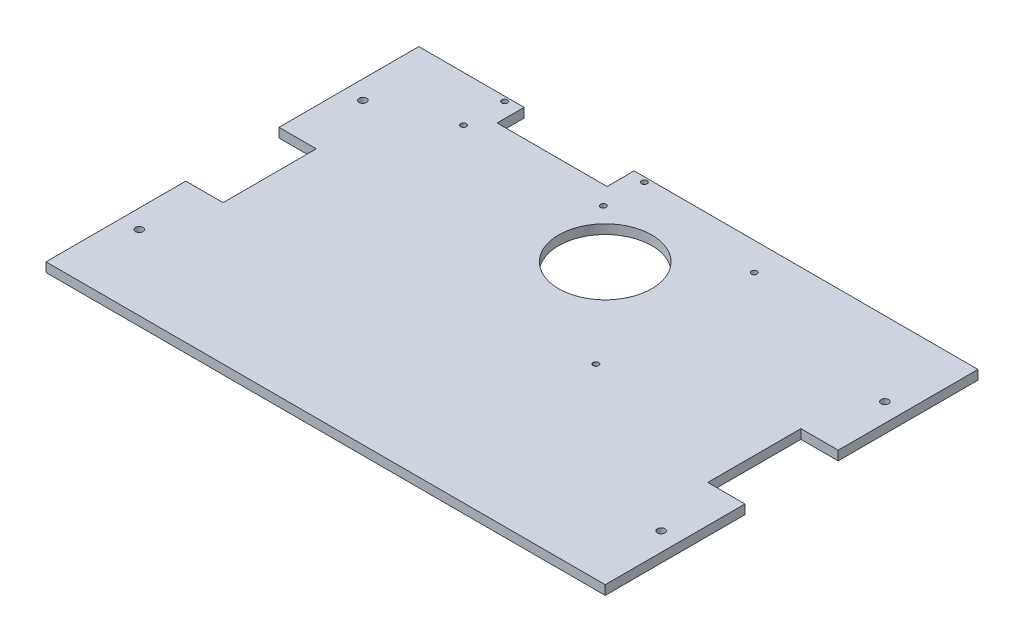
ISO-10303-21;
HEADER;
FILE_DESCRIPTION(('STEP AP214'),'2;1');
FILE_NAME('part.step','',(''),(''),'','','');
FILE_SCHEMA(('AUTOMOTIVE_DESIGN { 1 0 10303 214 1 1 1 1 }'));
ENDSEC;
DATA;
#1=APPLICATION_CONTEXT('core data for automotive mechanical design processes');
#2=APPLICATION_PROTOCOL_DEFINITION('international standard','automotive_design',2000,#1);
#3=PRODUCT_CONTEXT('',#1,'mechanical');
#4=PRODUCT('Part','Part','',(#3));
#5=PRODUCT_RELATED_PRODUCT_CATEGORY('part','',(#4));
#6=PRODUCT_DEFINITION_FORMATION('','',#4);
#7=PRODUCT_DEFINITION_CONTEXT('part definition',#1,'design');
#8=PRODUCT_DEFINITION('design','',#6,#7);
#9=PRODUCT_DEFINITION_SHAPE('','',#8);
#10=(LENGTH_UNIT() NAMED_UNIT(*) SI_UNIT(.MILLI.,.METRE.));
#11=(NAMED_UNIT(*) PLANE_ANGLE_UNIT() SI_UNIT($,.RADIAN.));
#12=(NAMED_UNIT(*) SI_UNIT($,.STERADIAN.) SOLID_ANGLE_UNIT());
#13=UNCERTAINTY_MEASURE_WITH_UNIT(LENGTH_MEASURE(1.E-05),#10,'distance_accuracy_value','');
#14=(GEOMETRIC_REPRESENTATION_CONTEXT(3) GLOBAL_UNCERTAINTY_ASSIGNED_CONTEXT((#13)) GLOBAL_UNIT_ASSIGNED_CONTEXT((#10,
#11,#12)) REPRESENTATION_CONTEXT('',''));
#15=CARTESIAN_POINT('',(0.,0.,0.));
#16=DIRECTION('',(0.,0.,1.));
#17=DIRECTION('',(1.,0.,0.));
#18=AXIS2_PLACEMENT_3D('',#15,#16,#17);
#19=CARTESIAN_POINT('',(150.,5.,-100.));
#20=DIRECTION('',(-1.,0.,0.));
#21=DIRECTION('',(0.,0.,1.));
#22=AXIS2_PLACEMENT_3D('',#19,#20,#21);
#23=PLANE('',#22);
#24=DIRECTION('',(0.,0.,-1.));
#25=VECTOR('',#24,1.);
#26=CARTESIAN_POINT('',(150.,5.,-100.));
#27=LINE('',#26,#25);
#28=CARTESIAN_POINT('',(150.,5.,-25.));
#29=VERTEX_POINT('',#28);
#30=CARTESIAN_POINT('',(150.,5.,-100.));
#31=VERTEX_POINT('',#30);
#32=EDGE_CURVE('E181',#29,#31,#27,.T.);
#33=ORIENTED_EDGE('',*,*,#32,.F.);
#34=DIRECTION('',(0.,1.,0.));
#35=VECTOR('',#34,1.);
#36=CARTESIAN_POINT('',(150.,0.,-25.));
#37=LINE('',#36,#35);
#38=CARTESIAN_POINT('',(150.,0.,-25.));
#39=VERTEX_POINT('',#38);
#40=EDGE_CURVE('E237',#39,#29,#37,.T.);
#41=ORIENTED_EDGE('',*,*,#40,.F.);
#42=DIRECTION('',(0.,0.,-1.));
#43=VECTOR('',#42,1.);
#44=CARTESIAN_POINT('',(150.,0.,-100.));
#45=LINE('',#44,#43);
#46=CARTESIAN_POINT('',(150.,0.,-100.));
#47=VERTEX_POINT('',#46);
#48=EDGE_CURVE('E312',#39,#47,#45,.T.);
#49=ORIENTED_EDGE('',*,*,#48,.T.);
#50=DIRECTION('',(0.,-1.,0.));
#51=VECTOR('',#50,1.);
#52=CARTESIAN_POINT('',(150.,5.,-100.));
#53=LINE('',#52,#51);
#54=EDGE_CURVE('E11',#31,#47,#53,.T.);
#55=ORIENTED_EDGE('',*,*,#54,.F.);
#56=EDGE_LOOP('',(#33,#41,#49,#55));
#57=FACE_BOUND('',#56,.T.);
#58=ADVANCED_FACE('F34',(#57),#23,.F.);
#59=CARTESIAN_POINT('',(-150.,5.,-100.));
#60=DIRECTION('',(1.,0.,0.));
#61=DIRECTION('',(0.,0.,-1.));
#62=AXIS2_PLACEMENT_3D('',#59,#60,#61);
#63=PLANE('',#62);
#64=DIRECTION('',(0.,0.,1.));
#65=VECTOR('',#64,1.);
#66=CARTESIAN_POINT('',(-150.,0.,-100.));
#67=LINE('',#66,#65);
#68=CARTESIAN_POINT('',(-150.,0.,-100.));
#69=VERTEX_POINT('',#68);
#70=CARTESIAN_POINT('',(-150.,0.,-25.));
#71=VERTEX_POINT('',#70);
#72=EDGE_CURVE('E171',#69,#71,#67,.T.);
#73=ORIENTED_EDGE('',*,*,#72,.T.);
#74=DIRECTION('',(0.,1.,0.));
#75=VECTOR('',#74,1.);
#76=CARTESIAN_POINT('',(-150.,0.,-25.));
#77=LINE('',#76,#75);
#78=CARTESIAN_POINT('',(-150.,5.,-25.));
#79=VERTEX_POINT('',#78);
#80=EDGE_CURVE('E213',#71,#79,#77,.T.);
#81=ORIENTED_EDGE('',*,*,#80,.T.);
#82=DIRECTION('',(0.,0.,1.));
#83=VECTOR('',#82,1.);
#84=CARTESIAN_POINT('',(-150.,5.,-100.));
#85=LINE('',#84,#83);
#86=CARTESIAN_POINT('',(-150.,5.,-100.));
#87=VERTEX_POINT('',#86);
#88=EDGE_CURVE('E195',#87,#79,#85,.T.);
#89=ORIENTED_EDGE('',*,*,#88,.F.);
#90=DIRECTION('',(0.,-1.,0.));
#91=VECTOR('',#90,1.);
#92=CARTESIAN_POINT('',(-150.,5.,-100.));
#93=LINE('',#92,#91);
#94=EDGE_CURVE('E42',#87,#69,#93,.T.);
#95=ORIENTED_EDGE('',*,*,#94,.T.);
#96=EDGE_LOOP('',(#73,#81,#89,#95));
#97=FACE_BOUND('',#96,.T.);
#98=ADVANCED_FACE('F192',(#97),#63,.F.);
#99=CARTESIAN_POINT('',(-150.,5.,-100.));
#100=DIRECTION('',(0.,0.,1.));
#101=DIRECTION('',(1.,0.,0.));
#102=AXIS2_PLACEMENT_3D('',#99,#100,#101);
#103=PLANE('',#102);
#104=DIRECTION('',(-1.,0.,0.));
#105=VECTOR('',#104,1.);
#106=CARTESIAN_POINT('',(-150.,5.,-100.));
#107=LINE('',#106,#105);
#108=CARTESIAN_POINT('',(-93.5,5.,-100.));
#109=VERTEX_POINT('',#108);
#110=EDGE_CURVE('E336',#109,#87,#107,.T.);
#111=ORIENTED_EDGE('',*,*,#110,.F.);
#112=DIRECTION('',(0.,-1.,0.));
#113=VECTOR('',#112,1.);
#114=CARTESIAN_POINT('',(-93.5,5.,-100.));
#115=LINE('',#114,#113);
#116=CARTESIAN_POINT('',(-93.5,0.,-100.));
#117=VERTEX_POINT('',#116);
#118=EDGE_CURVE('E263',#109,#117,#115,.T.);
#119=ORIENTED_EDGE('',*,*,#118,.T.);
#120=DIRECTION('',(-1.,0.,0.));
#121=VECTOR('',#120,1.);
#122=CARTESIAN_POINT('',(-150.,0.,-100.));
#123=LINE('',#122,#121);
#124=EDGE_CURVE('E176',#117,#69,#123,.T.);
#125=ORIENTED_EDGE('',*,*,#124,.T.);
#126=ORIENTED_EDGE('',*,*,#94,.F.);
#127=EDGE_LOOP('',(#111,#119,#125,#126));
#128=FACE_BOUND('',#127,.T.);
#129=ADVANCED_FACE('F384',(#128),#103,.F.);
#130=CARTESIAN_POINT('',(150.,0.,100.));
#131=VERTEX_POINT('',#130);
#132=CARTESIAN_POINT('',(150.,0.,25.));
#133=VERTEX_POINT('',#132);
#134=EDGE_CURVE('E341',#131,#133,#45,.T.);
#135=ORIENTED_EDGE('',*,*,#134,.T.);
#136=DIRECTION('',(0.,1.,0.));
#137=VECTOR('',#136,1.);
#138=CARTESIAN_POINT('',(150.,0.,25.));
#139=LINE('',#138,#137);
#140=CARTESIAN_POINT('',(150.,5.,25.));
#141=VERTEX_POINT('',#140);
#142=EDGE_CURVE('E57',#133,#141,#139,.T.);
#143=ORIENTED_EDGE('',*,*,#142,.T.);
#144=CARTESIAN_POINT('',(150.,5.,100.));
#145=VERTEX_POINT('',#144);
#146=EDGE_CURVE('E333',#145,#141,#27,.T.);
#147=ORIENTED_EDGE('',*,*,#146,.F.);
#148=DIRECTION('',(0.,-1.,0.));
#149=VECTOR('',#148,1.);
#150=CARTESIAN_POINT('',(150.,5.,100.));
#151=LINE('',#150,#149);
#152=EDGE_CURVE('E182',#145,#131,#151,.T.);
#153=ORIENTED_EDGE('',*,*,#152,.T.);
#154=EDGE_LOOP('',(#135,#143,#147,#153));
#155=FACE_BOUND('',#154,.T.);
#156=ADVANCED_FACE('F36',(#155),#23,.F.);
#157=CARTESIAN_POINT('',(-34.5,0.,-100.));
#158=VERTEX_POINT('',#157);
#159=EDGE_CURVE('E172',#47,#158,#123,.T.);
#160=ORIENTED_EDGE('',*,*,#159,.T.);
#161=DIRECTION('',(0.,-1.,0.));
#162=VECTOR('',#161,1.);
#163=CARTESIAN_POINT('',(-34.5,5.,-100.));
#164=LINE('',#163,#162);
#165=CARTESIAN_POINT('',(-34.5,5.,-100.));
#166=VERTEX_POINT('',#165);
#167=EDGE_CURVE('E275',#166,#158,#164,.T.);
#168=ORIENTED_EDGE('',*,*,#167,.F.);
#169=EDGE_CURVE('E337',#31,#166,#107,.T.);
#170=ORIENTED_EDGE('',*,*,#169,.F.);
#171=ORIENTED_EDGE('',*,*,#54,.T.);
#172=EDGE_LOOP('',(#160,#168,#170,#171));
#173=FACE_BOUND('',#172,.T.);
#174=ADVANCED_FACE('F355',(#173),#103,.F.);
#175=CARTESIAN_POINT('',(-150.,5.,25.));
#176=VERTEX_POINT('',#175);
#177=CARTESIAN_POINT('',(-150.,5.,100.));
#178=VERTEX_POINT('',#177);
#179=EDGE_CURVE('E164',#176,#178,#85,.T.);
#180=ORIENTED_EDGE('',*,*,#179,.F.);
#181=DIRECTION('',(0.,1.,0.));
#182=VECTOR('',#181,1.);
#183=CARTESIAN_POINT('',(-150.,0.,25.));
#184=LINE('',#183,#182);
#185=CARTESIAN_POINT('',(-150.,0.,25.));
#186=VERTEX_POINT('',#185);
#187=EDGE_CURVE('E151',#186,#176,#184,.T.);
#188=ORIENTED_EDGE('',*,*,#187,.F.);
#189=CARTESIAN_POINT('',(-150.,0.,100.));
#190=VERTEX_POINT('',#189);
#191=EDGE_CURVE('E162',#186,#190,#67,.T.);
#192=ORIENTED_EDGE('',*,*,#191,.T.);
#193=DIRECTION('',(0.,-1.,0.));
#194=VECTOR('',#193,1.);
#195=CARTESIAN_POINT('',(-150.,5.,100.));
#196=LINE('',#195,#194);
#197=EDGE_CURVE('E185',#178,#190,#196,.T.);
#198=ORIENTED_EDGE('',*,*,#197,.F.);
#199=EDGE_LOOP('',(#180,#188,#192,#198));
#200=FACE_BOUND('',#199,.T.);
#201=ADVANCED_FACE('F160',(#200),#63,.F.);
#202=CARTESIAN_POINT('',(-150.,5.,100.));
#203=DIRECTION('',(0.,0.,-1.));
#204=DIRECTION('',(-1.,0.,0.));
#205=AXIS2_PLACEMENT_3D('',#202,#203,#204);
#206=PLANE('',#205);
#207=DIRECTION('',(1.,0.,0.));
#208=VECTOR('',#207,1.);
#209=CARTESIAN_POINT('',(-150.,0.,100.));
#210=LINE('',#209,#208);
#211=EDGE_CURVE('E170',#190,#131,#210,.T.);
#212=ORIENTED_EDGE('',*,*,#211,.T.);
#213=ORIENTED_EDGE('',*,*,#152,.F.);
#214=DIRECTION('',(1.,0.,0.));
#215=VECTOR('',#214,1.);
#216=CARTESIAN_POINT('',(-150.,5.,100.));
#217=LINE('',#216,#215);
#218=EDGE_CURVE('E186',#178,#145,#217,.T.);
#219=ORIENTED_EDGE('',*,*,#218,.F.);
#220=ORIENTED_EDGE('',*,*,#197,.T.);
#221=EDGE_LOOP('',(#212,#213,#219,#220));
#222=FACE_BOUND('',#221,.T.);
#223=ADVANCED_FACE('F395',(#222),#206,.F.);
#224=CARTESIAN_POINT('',(0.,5.,0.));
#225=DIRECTION('',(0.,1.,0.));
#226=DIRECTION('',(0.,0.,1.));
#227=AXIS2_PLACEMENT_3D('',#224,#225,#226);
#228=PLANE('',#227);
#229=DIRECTION('',(-1.,0.,0.));
#230=VECTOR('',#229,1.);
#231=CARTESIAN_POINT('',(-130.,5.,-25.));
#232=LINE('',#231,#230);
#233=CARTESIAN_POINT('',(-130.,5.,-25.));
#234=VERTEX_POINT('',#233);
#235=EDGE_CURVE('E156',#234,#79,#232,.T.);
#236=ORIENTED_EDGE('',*,*,#235,.F.);
#237=DIRECTION('',(0.,0.,-1.));
#238=VECTOR('',#237,1.);
#239=CARTESIAN_POINT('',(-130.,5.,25.));
#240=LINE('',#239,#238);
#241=CARTESIAN_POINT('',(-130.,5.,25.));
#242=VERTEX_POINT('',#241);
#243=EDGE_CURVE('E208',#242,#234,#240,.T.);
#244=ORIENTED_EDGE('',*,*,#243,.F.);
#245=DIRECTION('',(1.,0.,0.));
#246=VECTOR('',#245,1.);
#247=CARTESIAN_POINT('',(-130.,5.,25.));
#248=LINE('',#247,#246);
#249=EDGE_CURVE('E206',#176,#242,#248,.T.);
#250=ORIENTED_EDGE('',*,*,#249,.F.);
#251=ORIENTED_EDGE('',*,*,#179,.T.);
#252=ORIENTED_EDGE('',*,*,#218,.T.);
#253=ORIENTED_EDGE('',*,*,#146,.T.);
#254=DIRECTION('',(1.,0.,0.));
#255=VECTOR('',#254,1.);
#256=CARTESIAN_POINT('',(130.,5.,25.));
#257=LINE('',#256,#255);
#258=CARTESIAN_POINT('',(130.,5.,25.));
#259=VERTEX_POINT('',#258);
#260=EDGE_CURVE('E232',#259,#141,#257,.T.);
#261=ORIENTED_EDGE('',*,*,#260,.F.);
#262=DIRECTION('',(0.,0.,1.));
#263=VECTOR('',#262,1.);
#264=CARTESIAN_POINT('',(130.,5.,25.));
#265=LINE('',#264,#263);
#266=CARTESIAN_POINT('',(130.,5.,-25.));
#267=VERTEX_POINT('',#266);
#268=EDGE_CURVE('E229',#267,#259,#265,.T.);
#269=ORIENTED_EDGE('',*,*,#268,.F.);
#270=DIRECTION('',(-1.,0.,0.));
#271=VECTOR('',#270,1.);
#272=CARTESIAN_POINT('',(130.,5.,-25.));
#273=LINE('',#272,#271);
#274=EDGE_CURVE('E223',#29,#267,#273,.T.);
#275=ORIENTED_EDGE('',*,*,#274,.F.);
#276=ORIENTED_EDGE('',*,*,#32,.T.);
#277=ORIENTED_EDGE('',*,*,#169,.T.);
#278=DIRECTION('',(0.,0.,1.));
#279=VECTOR('',#278,1.);
#280=CARTESIAN_POINT('',(-34.5,5.,-100.));
#281=LINE('',#280,#279);
#282=CARTESIAN_POINT('',(-34.5,5.,-85.5));
#283=VERTEX_POINT('',#282);
#284=EDGE_CURVE('E256',#166,#283,#281,.T.);
#285=ORIENTED_EDGE('',*,*,#284,.T.);
#286=DIRECTION('',(-1.,0.,0.));
#287=VECTOR('',#286,1.);
#288=CARTESIAN_POINT('',(-93.5,5.,-85.5));
#289=LINE('',#288,#287);
#290=CARTESIAN_POINT('',(-93.5,5.,-85.5));
#291=VERTEX_POINT('',#290);
#292=EDGE_CURVE('E260',#283,#291,#289,.T.);
#293=ORIENTED_EDGE('',*,*,#292,.T.);
#294=DIRECTION('',(0.,0.,-1.));
#295=VECTOR('',#294,1.);
#296=CARTESIAN_POINT('',(-93.5,5.,-100.));
#297=LINE('',#296,#295);
#298=EDGE_CURVE('E253',#291,#109,#297,.T.);
#299=ORIENTED_EDGE('',*,*,#298,.T.);
#300=ORIENTED_EDGE('',*,*,#110,.T.);
#301=ORIENTED_EDGE('',*,*,#88,.T.);
#302=EDGE_LOOP('',(#236,#244,#250,#251,#252,#253,#261,#269,#275,#276,#277,#285,#293,#299,#300,#301));
#303=FACE_BOUND('',#302,.T.);
#304=CARTESIAN_POINT('',(45.0000000000001,5.,-85.));
#305=DIRECTION('',(0.,1.,0.));
#306=DIRECTION('',(0.,0.,1.));
#307=AXIS2_PLACEMENT_3D('',#304,#305,#306);
#308=CIRCLE('',#307,1.5);
#309=CARTESIAN_POINT('',(45.0000000000001,5.,-83.5));
#310=VERTEX_POINT('',#309);
#311=EDGE_CURVE('E245',#310,#310,#308,.T.);
#312=ORIENTED_EDGE('',*,*,#311,.F.);
#313=EDGE_LOOP('',(#312));
#314=FACE_BOUND('',#313,.T.);
#315=CARTESIAN_POINT('',(45.0000000000001,5.,0.));
#316=DIRECTION('',(0.,1.,0.));
#317=DIRECTION('',(0.,0.,1.));
#318=AXIS2_PLACEMENT_3D('',#315,#316,#317);
#319=CIRCLE('',#318,1.5);
#320=CARTESIAN_POINT('',(45.0000000000001,5.,1.50000000000004));
#321=VERTEX_POINT('',#320);
#322=EDGE_CURVE('E215',#321,#321,#319,.T.);
#323=ORIENTED_EDGE('',*,*,#322,.F.);
#324=EDGE_LOOP('',(#323));
#325=FACE_BOUND('',#324,.T.);
#326=CARTESIAN_POINT('',(-101.5,5.,-75.4999999999999));
#327=DIRECTION('',(0.,1.,0.));
#328=DIRECTION('',(0.,0.,1.));
#329=AXIS2_PLACEMENT_3D('',#326,#327,#328);
#330=CIRCLE('',#329,1.5);
#331=CARTESIAN_POINT('',(-101.5,5.,-73.9999999999999));
#332=VERTEX_POINT('',#331);
#333=EDGE_CURVE('E272',#332,#332,#330,.T.);
#334=ORIENTED_EDGE('',*,*,#333,.F.);
#335=EDGE_LOOP('',(#334));
#336=FACE_BOUND('',#335,.T.);
#337=CARTESIAN_POINT('',(-26.5,5.,-75.5));
#338=DIRECTION('',(0.,1.,0.));
#339=DIRECTION('',(0.,0.,1.));
#340=AXIS2_PLACEMENT_3D('',#337,#338,#339);
#341=CIRCLE('',#340,1.5);
#342=CARTESIAN_POINT('',(-26.5,5.,-74.));
#343=VERTEX_POINT('',#342);
#344=EDGE_CURVE('E289',#343,#343,#341,.T.);
#345=ORIENTED_EDGE('',*,*,#344,.F.);
#346=EDGE_LOOP('',(#345));
#347=FACE_BOUND('',#346,.T.);
#348=CARTESIAN_POINT('',(-26.5,5.,-97.5));
#349=DIRECTION('',(0.,1.,0.));
#350=DIRECTION('',(0.,0.,1.));
#351=AXIS2_PLACEMENT_3D('',#348,#349,#350);
#352=CIRCLE('',#351,1.5);
#353=CARTESIAN_POINT('',(-26.5,5.,-96.));
#354=VERTEX_POINT('',#353);
#355=EDGE_CURVE('E283',#354,#354,#352,.T.);
#356=ORIENTED_EDGE('',*,*,#355,.F.);
#357=EDGE_LOOP('',(#356));
#358=FACE_BOUND('',#357,.T.);
#359=CARTESIAN_POINT('',(-101.5,5.,-97.4999999999999));
#360=DIRECTION('',(0.,1.,0.));
#361=DIRECTION('',(0.,0.,1.));
#362=AXIS2_PLACEMENT_3D('',#359,#360,#361);
#363=CIRCLE('',#362,1.5);
#364=CARTESIAN_POINT('',(-101.5,5.,-95.9999999999999));
#365=VERTEX_POINT('',#364);
#366=EDGE_CURVE('E282',#365,#365,#363,.T.);
#367=ORIENTED_EDGE('',*,*,#366,.F.);
#368=EDGE_LOOP('',(#367));
#369=FACE_BOUND('',#368,.T.);
#370=CARTESIAN_POINT('',(-140.,5.,-60.));
#371=DIRECTION('',(0.,1.,0.));
#372=DIRECTION('',(0.,0.,1.));
#373=AXIS2_PLACEMENT_3D('',#370,#371,#372);
#374=CIRCLE('',#373,2.);
#375=CARTESIAN_POINT('',(-140.,5.,-58.));
#376=VERTEX_POINT('',#375);
#377=EDGE_CURVE('E313',#376,#376,#374,.T.);
#378=ORIENTED_EDGE('',*,*,#377,.F.);
#379=EDGE_LOOP('',(#378));
#380=FACE_BOUND('',#379,.T.);
#381=CARTESIAN_POINT('',(-140.,5.,59.9999999999999));
#382=DIRECTION('',(0.,1.,0.));
#383=DIRECTION('',(0.,0.,-1.));
#384=AXIS2_PLACEMENT_3D('',#381,#382,#383);
#385=CIRCLE('',#384,2.);
#386=CARTESIAN_POINT('',(-140.,5.,57.9999999999999));
#387=VERTEX_POINT('',#386);
#388=EDGE_CURVE('E319',#387,#387,#385,.T.);
#389=ORIENTED_EDGE('',*,*,#388,.F.);
#390=EDGE_LOOP('',(#389));
#391=FACE_BOUND('',#390,.T.);
#392=CARTESIAN_POINT('',(0.,5.,-50.));
#393=DIRECTION('',(0.,1.,0.));
#394=DIRECTION('',(0.,0.,1.));
#395=AXIS2_PLACEMENT_3D('',#392,#393,#394);
#396=CIRCLE('',#395,25.);
#397=CARTESIAN_POINT('',(0.,5.,-25.));
#398=VERTEX_POINT('',#397);
#399=EDGE_CURVE('E325',#398,#398,#396,.T.);
#400=ORIENTED_EDGE('',*,*,#399,.F.);
#401=EDGE_LOOP('',(#400));
#402=FACE_BOUND('',#401,.T.);
#403=CARTESIAN_POINT('',(140.,5.,60.));
#404=DIRECTION('',(0.,1.,0.));
#405=DIRECTION('',(0.,0.,1.));
#406=AXIS2_PLACEMENT_3D('',#403,#404,#405);
#407=CIRCLE('',#406,2.);
#408=CARTESIAN_POINT('',(140.,5.,62.));
#409=VERTEX_POINT('',#408);
#410=EDGE_CURVE('E306',#409,#409,#407,.T.);
#411=ORIENTED_EDGE('',*,*,#410,.F.);
#412=EDGE_LOOP('',(#411));
#413=FACE_BOUND('',#412,.T.);
#414=CARTESIAN_POINT('',(140.,5.,-59.9999999999999));
#415=DIRECTION('',(0.,1.,0.));
#416=DIRECTION('',(0.,0.,-1.));
#417=AXIS2_PLACEMENT_3D('',#414,#415,#416);
#418=CIRCLE('',#417,2.);
#419=CARTESIAN_POINT('',(140.,5.,-61.9999999999999));
#420=VERTEX_POINT('',#419);
#421=EDGE_CURVE('E300',#420,#420,#418,.T.);
#422=ORIENTED_EDGE('',*,*,#421,.F.);
#423=EDGE_LOOP('',(#422));
#424=FACE_BOUND('',#423,.T.);
#425=ADVANCED_FACE('F358',(#303,#314,#325,#336,#347,#358,#369,#380,#391,#402,#413,#424),#228,.T.);
#426=CARTESIAN_POINT('',(0.,0.,0.));
#427=DIRECTION('',(0.,1.,0.));
#428=DIRECTION('',(0.,0.,1.));
#429=AXIS2_PLACEMENT_3D('',#426,#427,#428);
#430=PLANE('',#429);
#431=CARTESIAN_POINT('',(45.0000000000001,0.,-85.));
#432=DIRECTION('',(0.,1.,0.));
#433=DIRECTION('',(0.,0.,1.));
#434=AXIS2_PLACEMENT_3D('',#431,#432,#433);
#435=CIRCLE('',#434,1.5);
#436=CARTESIAN_POINT('',(45.0000000000001,0.,-83.5));
#437=VERTEX_POINT('',#436);
#438=EDGE_CURVE('E241',#437,#437,#435,.T.);
#439=ORIENTED_EDGE('',*,*,#438,.T.);
#440=EDGE_LOOP('',(#439));
#441=FACE_BOUND('',#440,.T.);
#442=CARTESIAN_POINT('',(45.0000000000001,0.,0.));
#443=DIRECTION('',(0.,1.,0.));
#444=DIRECTION('',(0.,0.,1.));
#445=AXIS2_PLACEMENT_3D('',#442,#443,#444);
#446=CIRCLE('',#445,1.5);
#447=CARTESIAN_POINT('',(45.0000000000001,0.,1.50000000000004));
#448=VERTEX_POINT('',#447);
#449=EDGE_CURVE('E248',#448,#448,#446,.T.);
#450=ORIENTED_EDGE('',*,*,#449,.T.);
#451=EDGE_LOOP('',(#450));
#452=FACE_BOUND('',#451,.T.);
#453=CARTESIAN_POINT('',(-101.5,0.,-75.4999999999999));
#454=DIRECTION('',(0.,1.,0.));
#455=DIRECTION('',(0.,0.,1.));
#456=AXIS2_PLACEMENT_3D('',#453,#454,#455);
#457=CIRCLE('',#456,1.5);
#458=CARTESIAN_POINT('',(-101.5,0.,-73.9999999999999));
#459=VERTEX_POINT('',#458);
#460=EDGE_CURVE('E292',#459,#459,#457,.T.);
#461=ORIENTED_EDGE('',*,*,#460,.T.);
#462=EDGE_LOOP('',(#461));
#463=FACE_BOUND('',#462,.T.);
#464=CARTESIAN_POINT('',(-26.5,0.,-75.5));
#465=DIRECTION('',(0.,1.,0.));
#466=DIRECTION('',(0.,0.,1.));
#467=AXIS2_PLACEMENT_3D('',#464,#465,#466);
#468=CIRCLE('',#467,1.5);
#469=CARTESIAN_POINT('',(-26.5,0.,-74.));
#470=VERTEX_POINT('',#469);
#471=EDGE_CURVE('E286',#470,#470,#468,.T.);
#472=ORIENTED_EDGE('',*,*,#471,.T.);
#473=EDGE_LOOP('',(#472));
#474=FACE_BOUND('',#473,.T.);
#475=CARTESIAN_POINT('',(-26.5,0.,-97.5));
#476=DIRECTION('',(0.,1.,0.));
#477=DIRECTION('',(0.,0.,1.));
#478=AXIS2_PLACEMENT_3D('',#475,#476,#477);
#479=CIRCLE('',#478,1.5);
#480=CARTESIAN_POINT('',(-26.5,0.,-96.));
#481=VERTEX_POINT('',#480);
#482=EDGE_CURVE('E279',#481,#481,#479,.T.);
#483=ORIENTED_EDGE('',*,*,#482,.T.);
#484=EDGE_LOOP('',(#483));
#485=FACE_BOUND('',#484,.T.);
#486=CARTESIAN_POINT('',(-101.5,0.,-97.4999999999999));
#487=DIRECTION('',(0.,1.,0.));
#488=DIRECTION('',(0.,0.,1.));
#489=AXIS2_PLACEMENT_3D('',#486,#487,#488);
#490=CIRCLE('',#489,1.5);
#491=CARTESIAN_POINT('',(-101.5,0.,-95.9999999999999));
#492=VERTEX_POINT('',#491);
#493=EDGE_CURVE('E297',#492,#492,#490,.T.);
#494=ORIENTED_EDGE('',*,*,#493,.T.);
#495=EDGE_LOOP('',(#494));
#496=FACE_BOUND('',#495,.T.);
#497=CARTESIAN_POINT('',(-140.,0.,-60.));
#498=DIRECTION('',(0.,1.,0.));
#499=DIRECTION('',(0.,0.,1.));
#500=AXIS2_PLACEMENT_3D('',#497,#498,#499);
#501=CIRCLE('',#500,2.);
#502=CARTESIAN_POINT('',(-140.,0.,-58.));
#503=VERTEX_POINT('',#502);
#504=EDGE_CURVE('E309',#503,#503,#501,.T.);
#505=ORIENTED_EDGE('',*,*,#504,.T.);
#506=EDGE_LOOP('',(#505));
#507=FACE_BOUND('',#506,.T.);
#508=CARTESIAN_POINT('',(-140.,0.,59.9999999999999));
#509=DIRECTION('',(0.,1.,0.));
#510=DIRECTION('',(0.,0.,-1.));
#511=AXIS2_PLACEMENT_3D('',#508,#509,#510);
#512=CIRCLE('',#511,2.);
#513=CARTESIAN_POINT('',(-140.,0.,57.9999999999999));
#514=VERTEX_POINT('',#513);
#515=EDGE_CURVE('E316',#514,#514,#512,.T.);
#516=ORIENTED_EDGE('',*,*,#515,.T.);
#517=EDGE_LOOP('',(#516));
#518=FACE_BOUND('',#517,.T.);
#519=CARTESIAN_POINT('',(0.,0.,-50.));
#520=DIRECTION('',(0.,1.,0.));
#521=DIRECTION('',(0.,0.,1.));
#522=AXIS2_PLACEMENT_3D('',#519,#520,#521);
#523=CIRCLE('',#522,25.);
#524=CARTESIAN_POINT('',(0.,0.,-25.));
#525=VERTEX_POINT('',#524);
#526=EDGE_CURVE('E322',#525,#525,#523,.T.);
#527=ORIENTED_EDGE('',*,*,#526,.T.);
#528=EDGE_LOOP('',(#527));
#529=FACE_BOUND('',#528,.T.);
#530=CARTESIAN_POINT('',(140.,0.,60.));
#531=DIRECTION('',(0.,1.,0.));
#532=DIRECTION('',(0.,0.,1.));
#533=AXIS2_PLACEMENT_3D('',#530,#531,#532);
#534=CIRCLE('',#533,2.);
#535=CARTESIAN_POINT('',(140.,0.,62.));
#536=VERTEX_POINT('',#535);
#537=EDGE_CURVE('E328',#536,#536,#534,.T.);
#538=ORIENTED_EDGE('',*,*,#537,.T.);
#539=EDGE_LOOP('',(#538));
#540=FACE_BOUND('',#539,.T.);
#541=CARTESIAN_POINT('',(140.,0.,-59.9999999999999));
#542=DIRECTION('',(0.,1.,0.));
#543=DIRECTION('',(0.,0.,-1.));
#544=AXIS2_PLACEMENT_3D('',#541,#542,#543);
#545=CIRCLE('',#544,2.);
#546=CARTESIAN_POINT('',(140.,0.,-61.9999999999999));
#547=VERTEX_POINT('',#546);
#548=EDGE_CURVE('E303',#547,#547,#545,.T.);
#549=ORIENTED_EDGE('',*,*,#548,.T.);
#550=EDGE_LOOP('',(#549));
#551=FACE_BOUND('',#550,.T.);
#552=DIRECTION('',(0.,0.,-1.));
#553=VECTOR('',#552,1.);
#554=CARTESIAN_POINT('',(-130.,0.,25.));
#555=LINE('',#554,#553);
#556=CARTESIAN_POINT('',(-130.,0.,25.));
#557=VERTEX_POINT('',#556);
#558=CARTESIAN_POINT('',(-130.,0.,-25.));
#559=VERTEX_POINT('',#558);
#560=EDGE_CURVE('E49',#557,#559,#555,.T.);
#561=ORIENTED_EDGE('',*,*,#560,.T.);
#562=DIRECTION('',(-1.,0.,0.));
#563=VECTOR('',#562,1.);
#564=CARTESIAN_POINT('',(-130.,0.,-25.));
#565=LINE('',#564,#563);
#566=EDGE_CURVE('E165',#559,#71,#565,.T.);
#567=ORIENTED_EDGE('',*,*,#566,.T.);
#568=ORIENTED_EDGE('',*,*,#72,.F.);
#569=ORIENTED_EDGE('',*,*,#124,.F.);
#570=DIRECTION('',(0.,0.,-1.));
#571=VECTOR('',#570,1.);
#572=CARTESIAN_POINT('',(-93.5,0.,-100.));
#573=LINE('',#572,#571);
#574=CARTESIAN_POINT('',(-93.5,0.,-85.5));
#575=VERTEX_POINT('',#574);
#576=EDGE_CURVE('E244',#575,#117,#573,.T.);
#577=ORIENTED_EDGE('',*,*,#576,.F.);
#578=DIRECTION('',(-1.,0.,0.));
#579=VECTOR('',#578,1.);
#580=CARTESIAN_POINT('',(-93.5,0.,-85.5));
#581=LINE('',#580,#579);
#582=CARTESIAN_POINT('',(-34.5,0.,-85.5));
#583=VERTEX_POINT('',#582);
#584=EDGE_CURVE('E257',#583,#575,#581,.T.);
#585=ORIENTED_EDGE('',*,*,#584,.F.);
#586=DIRECTION('',(0.,0.,1.));
#587=VECTOR('',#586,1.);
#588=CARTESIAN_POINT('',(-34.5,0.,-100.));
#589=LINE('',#588,#587);
#590=EDGE_CURVE('E265',#158,#583,#589,.T.);
#591=ORIENTED_EDGE('',*,*,#590,.F.);
#592=ORIENTED_EDGE('',*,*,#159,.F.);
#593=ORIENTED_EDGE('',*,*,#48,.F.);
#594=DIRECTION('',(-1.,0.,0.));
#595=VECTOR('',#594,1.);
#596=CARTESIAN_POINT('',(130.,0.,-25.));
#597=LINE('',#596,#595);
#598=CARTESIAN_POINT('',(130.,0.,-25.));
#599=VERTEX_POINT('',#598);
#600=EDGE_CURVE('E225',#39,#599,#597,.T.);
#601=ORIENTED_EDGE('',*,*,#600,.T.);
#602=DIRECTION('',(0.,0.,1.));
#603=VECTOR('',#602,1.);
#604=CARTESIAN_POINT('',(130.,0.,25.));
#605=LINE('',#604,#603);
#606=CARTESIAN_POINT('',(130.,0.,25.));
#607=VERTEX_POINT('',#606);
#608=EDGE_CURVE('E219',#599,#607,#605,.T.);
#609=ORIENTED_EDGE('',*,*,#608,.T.);
#610=DIRECTION('',(1.,0.,0.));
#611=VECTOR('',#610,1.);
#612=CARTESIAN_POINT('',(130.,0.,25.));
#613=LINE('',#612,#611);
#614=EDGE_CURVE('E222',#607,#133,#613,.T.);
#615=ORIENTED_EDGE('',*,*,#614,.T.);
#616=ORIENTED_EDGE('',*,*,#134,.F.);
#617=ORIENTED_EDGE('',*,*,#211,.F.);
#618=ORIENTED_EDGE('',*,*,#191,.F.);
#619=DIRECTION('',(1.,0.,0.));
#620=VECTOR('',#619,1.);
#621=CARTESIAN_POINT('',(-130.,0.,25.));
#622=LINE('',#621,#620);
#623=EDGE_CURVE('E147',#186,#557,#622,.T.);
#624=ORIENTED_EDGE('',*,*,#623,.T.);
#625=EDGE_LOOP('',(#561,#567,#568,#569,#577,#585,#591,#592,#593,#601,#609,#615,#616,#617,#618,#624));
#626=FACE_BOUND('',#625,.T.);
#627=ADVANCED_FACE('F168',(#441,#452,#463,#474,#485,#496,#507,#518,#529,#540,#551,#626),#430,.F.);
#628=CARTESIAN_POINT('',(140.,0.,-59.9999999999999));
#629=DIRECTION('',(0.,1.,0.));
#630=DIRECTION('',(0.,0.,1.));
#631=AXIS2_PLACEMENT_3D('',#628,#629,#630);
#632=CYLINDRICAL_SURFACE('',#631,2.);
#633=ORIENTED_EDGE('',*,*,#548,.F.);
#634=EDGE_LOOP('',(#633));
#635=FACE_BOUND('',#634,.T.);
#636=ORIENTED_EDGE('',*,*,#421,.T.);
#637=EDGE_LOOP('',(#636));
#638=FACE_BOUND('',#637,.T.);
#639=ADVANCED_FACE('F401',(#635,#638),#632,.F.);
#640=CARTESIAN_POINT('',(140.,0.,60.));
#641=DIRECTION('',(0.,1.,0.));
#642=DIRECTION('',(0.,0.,1.));
#643=AXIS2_PLACEMENT_3D('',#640,#641,#642);
#644=CYLINDRICAL_SURFACE('',#643,2.);
#645=ORIENTED_EDGE('',*,*,#537,.F.);
#646=EDGE_LOOP('',(#645));
#647=FACE_BOUND('',#646,.T.);
#648=ORIENTED_EDGE('',*,*,#410,.T.);
#649=EDGE_LOOP('',(#648));
#650=FACE_BOUND('',#649,.T.);
#651=ADVANCED_FACE('F405',(#647,#650),#644,.F.);
#652=CARTESIAN_POINT('',(0.,0.,-50.));
#653=DIRECTION('',(0.,1.,0.));
#654=DIRECTION('',(0.,0.,1.));
#655=AXIS2_PLACEMENT_3D('',#652,#653,#654);
#656=CYLINDRICAL_SURFACE('',#655,25.);
#657=ORIENTED_EDGE('',*,*,#526,.F.);
#658=EDGE_LOOP('',(#657));
#659=FACE_BOUND('',#658,.T.);
#660=ORIENTED_EDGE('',*,*,#399,.T.);
#661=EDGE_LOOP('',(#660));
#662=FACE_BOUND('',#661,.T.);
#663=ADVANCED_FACE('F408',(#659,#662),#656,.F.);
#664=CARTESIAN_POINT('',(-140.,0.,59.9999999999999));
#665=DIRECTION('',(0.,1.,0.));
#666=DIRECTION('',(0.,0.,1.));
#667=AXIS2_PLACEMENT_3D('',#664,#665,#666);
#668=CYLINDRICAL_SURFACE('',#667,2.);
#669=ORIENTED_EDGE('',*,*,#515,.F.);
#670=EDGE_LOOP('',(#669));
#671=FACE_BOUND('',#670,.T.);
#672=ORIENTED_EDGE('',*,*,#388,.T.);
#673=EDGE_LOOP('',(#672));
#674=FACE_BOUND('',#673,.T.);
#675=ADVANCED_FACE('F412',(#671,#674),#668,.F.);
#676=CARTESIAN_POINT('',(-140.,0.,-60.));
#677=DIRECTION('',(0.,1.,0.));
#678=DIRECTION('',(0.,0.,1.));
#679=AXIS2_PLACEMENT_3D('',#676,#677,#678);
#680=CYLINDRICAL_SURFACE('',#679,2.);
#681=ORIENTED_EDGE('',*,*,#504,.F.);
#682=EDGE_LOOP('',(#681));
#683=FACE_BOUND('',#682,.T.);
#684=ORIENTED_EDGE('',*,*,#377,.T.);
#685=EDGE_LOOP('',(#684));
#686=FACE_BOUND('',#685,.T.);
#687=ADVANCED_FACE('F416',(#683,#686),#680,.F.);
#688=CARTESIAN_POINT('',(-101.5,0.,-97.4999999999999));
#689=DIRECTION('',(0.,1.,0.));
#690=DIRECTION('',(0.,0.,1.));
#691=AXIS2_PLACEMENT_3D('',#688,#689,#690);
#692=CYLINDRICAL_SURFACE('',#691,1.5);
#693=ORIENTED_EDGE('',*,*,#493,.F.);
#694=EDGE_LOOP('',(#693));
#695=FACE_BOUND('',#694,.T.);
#696=ORIENTED_EDGE('',*,*,#366,.T.);
#697=EDGE_LOOP('',(#696));
#698=FACE_BOUND('',#697,.T.);
#699=ADVANCED_FACE('F420',(#695,#698),#692,.F.);
#700=CARTESIAN_POINT('',(-26.5,0.,-97.5));
#701=DIRECTION('',(0.,1.,0.));
#702=DIRECTION('',(0.,0.,1.));
#703=AXIS2_PLACEMENT_3D('',#700,#701,#702);
#704=CYLINDRICAL_SURFACE('',#703,1.5);
#705=ORIENTED_EDGE('',*,*,#482,.F.);
#706=EDGE_LOOP('',(#705));
#707=FACE_BOUND('',#706,.T.);
#708=ORIENTED_EDGE('',*,*,#355,.T.);
#709=EDGE_LOOP('',(#708));
#710=FACE_BOUND('',#709,.T.);
#711=ADVANCED_FACE('F427',(#707,#710),#704,.F.);
#712=CARTESIAN_POINT('',(-26.5,0.,-75.5));
#713=DIRECTION('',(0.,1.,0.));
#714=DIRECTION('',(0.,0.,1.));
#715=AXIS2_PLACEMENT_3D('',#712,#713,#714);
#716=CYLINDRICAL_SURFACE('',#715,1.5);
#717=ORIENTED_EDGE('',*,*,#471,.F.);
#718=EDGE_LOOP('',(#717));
#719=FACE_BOUND('',#718,.T.);
#720=ORIENTED_EDGE('',*,*,#344,.T.);
#721=EDGE_LOOP('',(#720));
#722=FACE_BOUND('',#721,.T.);
#723=ADVANCED_FACE('F433',(#719,#722),#716,.F.);
#724=CARTESIAN_POINT('',(-101.5,0.,-75.4999999999999));
#725=DIRECTION('',(0.,1.,0.));
#726=DIRECTION('',(0.,0.,1.));
#727=AXIS2_PLACEMENT_3D('',#724,#725,#726);
#728=CYLINDRICAL_SURFACE('',#727,1.5);
#729=ORIENTED_EDGE('',*,*,#460,.F.);
#730=EDGE_LOOP('',(#729));
#731=FACE_BOUND('',#730,.T.);
#732=ORIENTED_EDGE('',*,*,#333,.T.);
#733=EDGE_LOOP('',(#732));
#734=FACE_BOUND('',#733,.T.);
#735=ADVANCED_FACE('F429',(#731,#734),#728,.F.);
#736=CARTESIAN_POINT('',(-93.5,5.,-100.));
#737=DIRECTION('',(-1.,0.,0.));
#738=DIRECTION('',(0.,0.,1.));
#739=AXIS2_PLACEMENT_3D('',#736,#737,#738);
#740=PLANE('',#739);
#741=ORIENTED_EDGE('',*,*,#576,.T.);
#742=ORIENTED_EDGE('',*,*,#118,.F.);
#743=ORIENTED_EDGE('',*,*,#298,.F.);
#744=DIRECTION('',(0.,-1.,0.));
#745=VECTOR('',#744,1.);
#746=CARTESIAN_POINT('',(-93.5,5.,-85.5));
#747=LINE('',#746,#745);
#748=EDGE_CURVE('E270',#291,#575,#747,.T.);
#749=ORIENTED_EDGE('',*,*,#748,.T.);
#750=EDGE_LOOP('',(#741,#742,#743,#749));
#751=FACE_BOUND('',#750,.T.);
#752=ADVANCED_FACE('F432',(#751),#740,.F.);
#753=CARTESIAN_POINT('',(-93.5,5.,-85.5));
#754=DIRECTION('',(0.,0.,1.));
#755=DIRECTION('',(1.,0.,0.));
#756=AXIS2_PLACEMENT_3D('',#753,#754,#755);
#757=PLANE('',#756);
#758=ORIENTED_EDGE('',*,*,#584,.T.);
#759=ORIENTED_EDGE('',*,*,#748,.F.);
#760=ORIENTED_EDGE('',*,*,#292,.F.);
#761=DIRECTION('',(0.,-1.,0.));
#762=VECTOR('',#761,1.);
#763=CARTESIAN_POINT('',(-34.5,5.,-85.5));
#764=LINE('',#763,#762);
#765=EDGE_CURVE('E273',#283,#583,#764,.T.);
#766=ORIENTED_EDGE('',*,*,#765,.T.);
#767=EDGE_LOOP('',(#758,#759,#760,#766));
#768=FACE_BOUND('',#767,.T.);
#769=ADVANCED_FACE('F443',(#768),#757,.F.);
#770=CARTESIAN_POINT('',(-34.5,5.,-100.));
#771=DIRECTION('',(1.,0.,0.));
#772=DIRECTION('',(0.,0.,-1.));
#773=AXIS2_PLACEMENT_3D('',#770,#771,#772);
#774=PLANE('',#773);
#775=ORIENTED_EDGE('',*,*,#590,.T.);
#776=ORIENTED_EDGE('',*,*,#765,.F.);
#777=ORIENTED_EDGE('',*,*,#284,.F.);
#778=ORIENTED_EDGE('',*,*,#167,.T.);
#779=EDGE_LOOP('',(#775,#776,#777,#778));
#780=FACE_BOUND('',#779,.T.);
#781=ADVANCED_FACE('F445',(#780),#774,.F.);
#782=CARTESIAN_POINT('',(45.0000000000001,0.,0.));
#783=DIRECTION('',(0.,1.,0.));
#784=DIRECTION('',(0.,0.,1.));
#785=AXIS2_PLACEMENT_3D('',#782,#783,#784);
#786=CYLINDRICAL_SURFACE('',#785,1.5);
#787=ORIENTED_EDGE('',*,*,#449,.F.);
#788=EDGE_LOOP('',(#787));
#789=FACE_BOUND('',#788,.T.);
#790=ORIENTED_EDGE('',*,*,#322,.T.);
#791=EDGE_LOOP('',(#790));
#792=FACE_BOUND('',#791,.T.);
#793=ADVANCED_FACE('F448',(#789,#792),#786,.F.);
#794=CARTESIAN_POINT('',(45.0000000000001,0.,-85.));
#795=DIRECTION('',(0.,1.,0.));
#796=DIRECTION('',(0.,0.,1.));
#797=AXIS2_PLACEMENT_3D('',#794,#795,#796);
#798=CYLINDRICAL_SURFACE('',#797,1.5);
#799=ORIENTED_EDGE('',*,*,#438,.F.);
#800=EDGE_LOOP('',(#799));
#801=FACE_BOUND('',#800,.T.);
#802=ORIENTED_EDGE('',*,*,#311,.T.);
#803=EDGE_LOOP('',(#802));
#804=FACE_BOUND('',#803,.T.);
#805=ADVANCED_FACE('F455',(#801,#804),#798,.F.);
#806=CARTESIAN_POINT('',(130.,0.,25.));
#807=DIRECTION('',(-1.,0.,0.));
#808=DIRECTION('',(0.,0.,1.));
#809=AXIS2_PLACEMENT_3D('',#806,#807,#808);
#810=PLANE('',#809);
#811=ORIENTED_EDGE('',*,*,#268,.T.);
#812=DIRECTION('',(0.,1.,0.));
#813=VECTOR('',#812,1.);
#814=CARTESIAN_POINT('',(130.,0.,25.));
#815=LINE('',#814,#813);
#816=EDGE_CURVE('E228',#607,#259,#815,.T.);
#817=ORIENTED_EDGE('',*,*,#816,.F.);
#818=ORIENTED_EDGE('',*,*,#608,.F.);
#819=DIRECTION('',(0.,1.,0.));
#820=VECTOR('',#819,1.);
#821=CARTESIAN_POINT('',(130.,0.,-25.));
#822=LINE('',#821,#820);
#823=EDGE_CURVE('E209',#599,#267,#822,.T.);
#824=ORIENTED_EDGE('',*,*,#823,.T.);
#825=EDGE_LOOP('',(#811,#817,#818,#824));
#826=FACE_BOUND('',#825,.T.);
#827=ADVANCED_FACE('F367',(#826),#810,.F.);
#828=CARTESIAN_POINT('',(130.,0.,-25.));
#829=DIRECTION('',(0.,0.,-1.));
#830=DIRECTION('',(-1.,0.,0.));
#831=AXIS2_PLACEMENT_3D('',#828,#829,#830);
#832=PLANE('',#831);
#833=ORIENTED_EDGE('',*,*,#274,.T.);
#834=ORIENTED_EDGE('',*,*,#823,.F.);
#835=ORIENTED_EDGE('',*,*,#600,.F.);
#836=ORIENTED_EDGE('',*,*,#40,.T.);
#837=EDGE_LOOP('',(#833,#834,#835,#836));
#838=FACE_BOUND('',#837,.T.);
#839=ADVANCED_FACE('F364',(#838),#832,.F.);
#840=CARTESIAN_POINT('',(130.,0.,25.));
#841=DIRECTION('',(0.,0.,1.));
#842=DIRECTION('',(1.,0.,0.));
#843=AXIS2_PLACEMENT_3D('',#840,#841,#842);
#844=PLANE('',#843);
#845=ORIENTED_EDGE('',*,*,#260,.T.);
#846=ORIENTED_EDGE('',*,*,#142,.F.);
#847=ORIENTED_EDGE('',*,*,#614,.F.);
#848=ORIENTED_EDGE('',*,*,#816,.T.);
#849=EDGE_LOOP('',(#845,#846,#847,#848));
#850=FACE_BOUND('',#849,.T.);
#851=ADVANCED_FACE('F368',(#850),#844,.F.);
#852=CARTESIAN_POINT('',(-130.,0.,-25.));
#853=DIRECTION('',(0.,0.,-1.));
#854=DIRECTION('',(-1.,0.,0.));
#855=AXIS2_PLACEMENT_3D('',#852,#853,#854);
#856=PLANE('',#855);
#857=ORIENTED_EDGE('',*,*,#235,.T.);
#858=ORIENTED_EDGE('',*,*,#80,.F.);
#859=ORIENTED_EDGE('',*,*,#566,.F.);
#860=DIRECTION('',(0.,1.,0.));
#861=VECTOR('',#860,1.);
#862=CARTESIAN_POINT('',(-130.,0.,-25.));
#863=LINE('',#862,#861);
#864=EDGE_CURVE('E216',#559,#234,#863,.T.);
#865=ORIENTED_EDGE('',*,*,#864,.T.);
#866=EDGE_LOOP('',(#857,#858,#859,#865));
#867=FACE_BOUND('',#866,.T.);
#868=ADVANCED_FACE('F370',(#867),#856,.F.);
#869=CARTESIAN_POINT('',(-130.,0.,25.));
#870=DIRECTION('',(1.,0.,0.));
#871=DIRECTION('',(0.,0.,-1.));
#872=AXIS2_PLACEMENT_3D('',#869,#870,#871);
#873=PLANE('',#872);
#874=ORIENTED_EDGE('',*,*,#243,.T.);
#875=ORIENTED_EDGE('',*,*,#864,.F.);
#876=ORIENTED_EDGE('',*,*,#560,.F.);
#877=DIRECTION('',(0.,1.,0.));
#878=VECTOR('',#877,1.);
#879=CARTESIAN_POINT('',(-130.,0.,25.));
#880=LINE('',#879,#878);
#881=EDGE_CURVE('E153',#557,#242,#880,.T.);
#882=ORIENTED_EDGE('',*,*,#881,.T.);
#883=EDGE_LOOP('',(#874,#875,#876,#882));
#884=FACE_BOUND('',#883,.T.);
#885=ADVANCED_FACE('F376',(#884),#873,.F.);
#886=CARTESIAN_POINT('',(-130.,0.,25.));
#887=DIRECTION('',(0.,0.,1.));
#888=DIRECTION('',(1.,0.,0.));
#889=AXIS2_PLACEMENT_3D('',#886,#887,#888);
#890=PLANE('',#889);
#891=ORIENTED_EDGE('',*,*,#249,.T.);
#892=ORIENTED_EDGE('',*,*,#881,.F.);
#893=ORIENTED_EDGE('',*,*,#623,.F.);
#894=ORIENTED_EDGE('',*,*,#187,.T.);
#895=EDGE_LOOP('',(#891,#892,#893,#894));
#896=FACE_BOUND('',#895,.T.);
#897=ADVANCED_FACE('F150',(#896),#890,.F.);
#898=CLOSED_SHELL('',(#58,#98,#129,#156,#174,#201,#223,#425,#627,#639,#651,#663,#675,#687,#699,
#711,#723,#735,#752,#769,#781,#793,#805,#827,#839,#851,#868,#885,#897));
#899=MANIFOLD_SOLID_BREP('B2',#898);
#900=ADVANCED_BREP_SHAPE_REPRESENTATION('',(#18,#899),#14);
#901=SHAPE_DEFINITION_REPRESENTATION(#9,#900);
ENDSEC;
END-ISO-10303-21;
